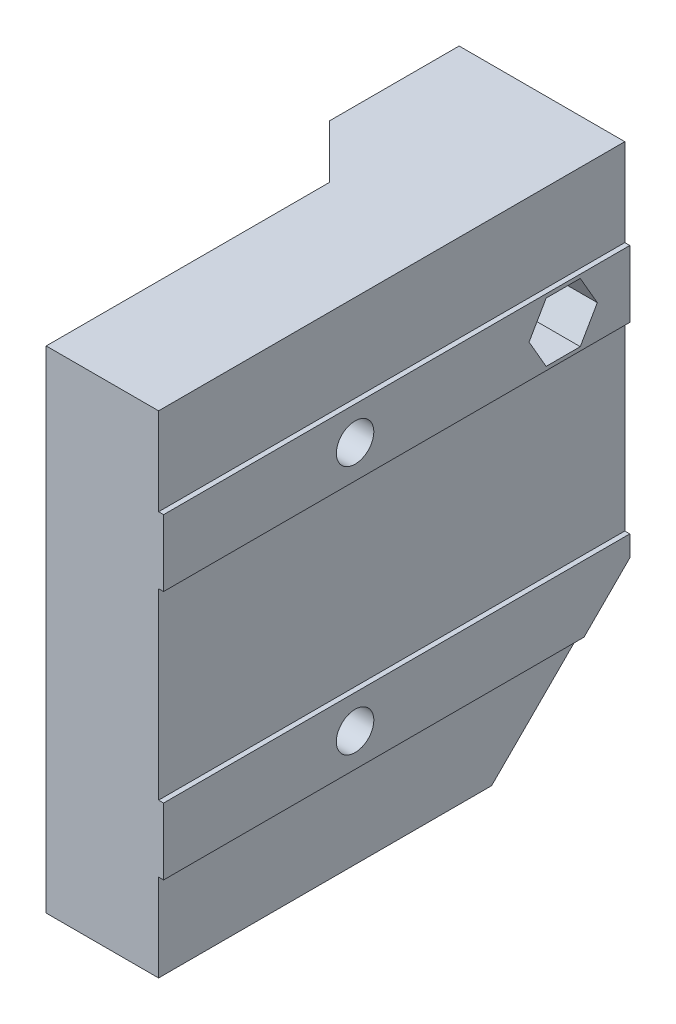
ISO-10303-21;
HEADER;
FILE_DESCRIPTION(('STEP AP214'),'2;1');
FILE_NAME('part.step','',(''),(''),'','','');
FILE_SCHEMA(('AUTOMOTIVE_DESIGN { 1 0 10303 214 1 1 1 1 }'));
ENDSEC;
DATA;
#1=APPLICATION_CONTEXT('core data for automotive mechanical design processes');
#2=APPLICATION_PROTOCOL_DEFINITION('international standard','automotive_design',2000,#1);
#3=PRODUCT_CONTEXT('',#1,'mechanical');
#4=PRODUCT('Part','Part','',(#3));
#5=PRODUCT_RELATED_PRODUCT_CATEGORY('part','',(#4));
#6=PRODUCT_DEFINITION_FORMATION('','',#4);
#7=PRODUCT_DEFINITION_CONTEXT('part definition',#1,'design');
#8=PRODUCT_DEFINITION('design','',#6,#7);
#9=PRODUCT_DEFINITION_SHAPE('','',#8);
#10=(LENGTH_UNIT() NAMED_UNIT(*) SI_UNIT(.MILLI.,.METRE.));
#11=(NAMED_UNIT(*) PLANE_ANGLE_UNIT() SI_UNIT($,.RADIAN.));
#12=(NAMED_UNIT(*) SI_UNIT($,.STERADIAN.) SOLID_ANGLE_UNIT());
#13=UNCERTAINTY_MEASURE_WITH_UNIT(LENGTH_MEASURE(1.E-05),#10,'distance_accuracy_value','');
#14=(GEOMETRIC_REPRESENTATION_CONTEXT(3) GLOBAL_UNCERTAINTY_ASSIGNED_CONTEXT((#13)) GLOBAL_UNIT_ASSIGNED_CONTEXT((#10,
#11,#12)) REPRESENTATION_CONTEXT('',''));
#15=CARTESIAN_POINT('',(0.,0.,0.));
#16=DIRECTION('',(0.,0.,1.));
#17=DIRECTION('',(1.,0.,0.));
#18=AXIS2_PLACEMENT_3D('',#15,#16,#17);
#19=CARTESIAN_POINT('',(-4.9,6.5,-33.));
#20=DIRECTION('',(-1.,0.,0.));
#21=DIRECTION('',(0.,0.,1.));
#22=AXIS2_PLACEMENT_3D('',#19,#20,#21);
#23=PLANE('',#22);
#24=CARTESIAN_POINT('',(-4.9,19.,-25.));
#25=DIRECTION('',(-1.,0.,0.));
#26=DIRECTION('',(0.,0.,1.));
#27=AXIS2_PLACEMENT_3D('',#24,#25,#26);
#28=CIRCLE('',#27,4.69999999999999);
#29=CARTESIAN_POINT('',(-4.9,19.,-20.3));
#30=VERTEX_POINT('',#29);
#31=EDGE_CURVE('E11',#30,#30,#28,.F.);
#32=ORIENTED_EDGE('',*,*,#31,.T.);
#33=EDGE_LOOP('',(#32));
#34=FACE_BOUND('',#33,.T.);
#35=DIRECTION('',(0.,0.,1.));
#36=VECTOR('',#35,1.);
#37=CARTESIAN_POINT('',(-4.9,33.5,-33.));
#38=LINE('',#37,#36);
#39=CARTESIAN_POINT('',(-4.9,33.5,-33.));
#40=VERTEX_POINT('',#39);
#41=CARTESIAN_POINT('',(-4.9,33.5,-17.4000000000001));
#42=VERTEX_POINT('',#41);
#43=EDGE_CURVE('E269',#40,#42,#38,.T.);
#44=ORIENTED_EDGE('',*,*,#43,.F.);
#45=DIRECTION('',(0.,1.,0.));
#46=VECTOR('',#45,1.);
#47=CARTESIAN_POINT('',(-4.9,6.5,-33.));
#48=LINE('',#47,#46);
#49=CARTESIAN_POINT('',(-4.9,6.5,-33.));
#50=VERTEX_POINT('',#49);
#51=EDGE_CURVE('E268',#50,#40,#48,.T.);
#52=ORIENTED_EDGE('',*,*,#51,.F.);
#53=DIRECTION('',(0.,0.,1.));
#54=VECTOR('',#53,1.);
#55=CARTESIAN_POINT('',(-4.9,6.5,-33.));
#56=LINE('',#55,#54);
#57=CARTESIAN_POINT('',(-4.9,6.5,-17.4000000000001));
#58=VERTEX_POINT('',#57);
#59=EDGE_CURVE('E262',#50,#58,#56,.T.);
#60=ORIENTED_EDGE('',*,*,#59,.T.);
#61=DIRECTION('',(0.,1.,0.));
#62=VECTOR('',#61,1.);
#63=CARTESIAN_POINT('',(-4.9,6.5,-17.4000000000001));
#64=LINE('',#63,#62);
#65=EDGE_CURVE('E277',#58,#42,#64,.T.);
#66=ORIENTED_EDGE('',*,*,#65,.T.);
#67=EDGE_LOOP('',(#44,#52,#60,#66));
#68=FACE_BOUND('',#67,.T.);
#69=ADVANCED_FACE('F35',(#34,#68),#23,.T.);
#70=CARTESIAN_POINT('',(15.6,19.,-25.));
#71=DIRECTION('',(-1.,0.,0.));
#72=DIRECTION('',(0.,0.,1.));
#73=AXIS2_PLACEMENT_3D('',#70,#71,#72);
#74=CYLINDRICAL_SURFACE('',#73,2.1);
#75=CARTESIAN_POINT('',(9.6,19.,-25.));
#76=DIRECTION('',(1.,0.,0.));
#77=DIRECTION('',(0.,0.,-1.));
#78=AXIS2_PLACEMENT_3D('',#75,#76,#77);
#79=CIRCLE('',#78,2.1);
#80=CARTESIAN_POINT('',(9.6,19.,-27.1));
#81=VERTEX_POINT('',#80);
#82=EDGE_CURVE('E247',#81,#81,#79,.F.);
#83=ORIENTED_EDGE('',*,*,#82,.F.);
#84=EDGE_LOOP('',(#83));
#85=FACE_BOUND('',#84,.T.);
#86=CARTESIAN_POINT('',(-5.6,19.,-25.));
#87=DIRECTION('',(-1.,0.,0.));
#88=DIRECTION('',(0.,0.,1.));
#89=AXIS2_PLACEMENT_3D('',#86,#87,#88);
#90=CIRCLE('',#89,2.1);
#91=CARTESIAN_POINT('',(-5.6,19.,-22.9));
#92=VERTEX_POINT('',#91);
#93=EDGE_CURVE('E225',#92,#92,#90,.T.);
#94=ORIENTED_EDGE('',*,*,#93,.T.);
#95=EDGE_LOOP('',(#94));
#96=FACE_BOUND('',#95,.T.);
#97=ADVANCED_FACE('F408',(#85,#96),#74,.F.);
#98=CARTESIAN_POINT('',(15.,-15.,10.));
#99=DIRECTION('',(-1.,0.,0.));
#100=DIRECTION('',(0.,-1.,0.));
#101=AXIS2_PLACEMENT_3D('',#98,#99,#100);
#102=PLANE('',#101);
#103=DIRECTION('',(0.,0.,-1.));
#104=VECTOR('',#103,1.);
#105=CARTESIAN_POINT('',(15.,-25.5,10.));
#106=LINE('',#105,#104);
#107=CARTESIAN_POINT('',(15.,-25.5,23.));
#108=VERTEX_POINT('',#107);
#109=CARTESIAN_POINT('',(15.,-25.5,-16.9999999999999));
#110=VERTEX_POINT('',#109);
#111=EDGE_CURVE('E366',#108,#110,#106,.T.);
#112=ORIENTED_EDGE('',*,*,#111,.T.);
#113=DIRECTION('',(0.,0.707106781186547,-0.707106781186549));
#114=VECTOR('',#113,1.);
#115=CARTESIAN_POINT('',(15.,-9.49999999999999,-33.));
#116=LINE('',#115,#114);
#117=CARTESIAN_POINT('',(15.,-15.,-27.5));
#118=VERTEX_POINT('',#117);
#119=EDGE_CURVE('E388',#110,#118,#116,.T.);
#120=ORIENTED_EDGE('',*,*,#119,.T.);
#121=DIRECTION('',(0.,0.,-1.));
#122=VECTOR('',#121,1.);
#123=CARTESIAN_POINT('',(15.,-15.,10.));
#124=LINE('',#123,#122);
#125=CARTESIAN_POINT('',(15.,-15.,23.));
#126=VERTEX_POINT('',#125);
#127=EDGE_CURVE('E384',#126,#118,#124,.T.);
#128=ORIENTED_EDGE('',*,*,#127,.F.);
#129=DIRECTION('',(0.,1.,0.));
#130=VECTOR('',#129,1.);
#131=CARTESIAN_POINT('',(15.,-25.5,23.));
#132=LINE('',#131,#130);
#133=EDGE_CURVE('E316',#108,#126,#132,.T.);
#134=ORIENTED_EDGE('',*,*,#133,.F.);
#135=EDGE_LOOP('',(#112,#120,#128,#134));
#136=FACE_BOUND('',#135,.T.);
#137=ADVANCED_FACE('F414',(#136),#102,.F.);
#138=CARTESIAN_POINT('',(15.,-15.,10.));
#139=DIRECTION('',(0.,1.,0.));
#140=DIRECTION('',(0.,0.,1.));
#141=AXIS2_PLACEMENT_3D('',#138,#139,#140);
#142=PLANE('',#141);
#143=ORIENTED_EDGE('',*,*,#127,.T.);
#144=DIRECTION('',(1.,0.,0.));
#145=VECTOR('',#144,1.);
#146=CARTESIAN_POINT('',(0.,-15.,-27.5));
#147=LINE('',#146,#145);
#148=CARTESIAN_POINT('',(15.6,-15.,-27.5));
#149=VERTEX_POINT('',#148);
#150=EDGE_CURVE('E58',#118,#149,#147,.T.);
#151=ORIENTED_EDGE('',*,*,#150,.T.);
#152=DIRECTION('',(0.,0.,-1.));
#153=VECTOR('',#152,1.);
#154=CARTESIAN_POINT('',(15.6,-15.,10.));
#155=LINE('',#154,#153);
#156=CARTESIAN_POINT('',(15.6,-15.,23.));
#157=VERTEX_POINT('',#156);
#158=EDGE_CURVE('E507',#157,#149,#155,.T.);
#159=ORIENTED_EDGE('',*,*,#158,.F.);
#160=DIRECTION('',(1.,0.,0.));
#161=VECTOR('',#160,1.);
#162=CARTESIAN_POINT('',(15.,-15.,23.));
#163=LINE('',#162,#161);
#164=EDGE_CURVE('E319',#126,#157,#163,.T.);
#165=ORIENTED_EDGE('',*,*,#164,.F.);
#166=EDGE_LOOP('',(#143,#151,#159,#165));
#167=FACE_BOUND('',#166,.T.);
#168=ADVANCED_FACE('F485',(#167),#142,.F.);
#169=CARTESIAN_POINT('',(15.6,-7.,10.));
#170=DIRECTION('',(-1.,0.,0.));
#171=DIRECTION('',(0.,0.,1.));
#172=AXIS2_PLACEMENT_3D('',#169,#170,#171);
#173=PLANE('',#172);
#174=CARTESIAN_POINT('',(15.6,-11.,0.));
#175=DIRECTION('',(-1.,0.,0.));
#176=DIRECTION('',(0.,0.,1.));
#177=AXIS2_PLACEMENT_3D('',#174,#175,#176);
#178=CIRCLE('',#177,2.24999999999999);
#179=CARTESIAN_POINT('',(15.6,-11.,2.24999999999999));
#180=VERTEX_POINT('',#179);
#181=EDGE_CURVE('E349',#180,#180,#178,.T.);
#182=ORIENTED_EDGE('',*,*,#181,.T.);
#183=EDGE_LOOP('',(#182));
#184=FACE_BOUND('',#183,.T.);
#185=ORIENTED_EDGE('',*,*,#158,.T.);
#186=DIRECTION('',(0.,0.707106781186547,-0.707106781186549));
#187=VECTOR('',#186,1.);
#188=CARTESIAN_POINT('',(15.6,-9.5,-33.));
#189=LINE('',#188,#187);
#190=CARTESIAN_POINT('',(15.6,-9.49999999999999,-33.));
#191=VERTEX_POINT('',#190);
#192=EDGE_CURVE('E391',#149,#191,#189,.T.);
#193=ORIENTED_EDGE('',*,*,#192,.T.);
#194=DIRECTION('',(0.,-1.,0.));
#195=VECTOR('',#194,1.);
#196=CARTESIAN_POINT('',(15.6,-7.,-33.));
#197=LINE('',#196,#195);
#198=CARTESIAN_POINT('',(15.6,-7.,-33.));
#199=VERTEX_POINT('',#198);
#200=EDGE_CURVE('E309',#199,#191,#197,.T.);
#201=ORIENTED_EDGE('',*,*,#200,.F.);
#202=DIRECTION('',(0.,0.,-1.));
#203=VECTOR('',#202,1.);
#204=CARTESIAN_POINT('',(15.6,-7.,10.));
#205=LINE('',#204,#203);
#206=CARTESIAN_POINT('',(15.6,-7.,23.));
#207=VERTEX_POINT('',#206);
#208=EDGE_CURVE('E509',#207,#199,#205,.T.);
#209=ORIENTED_EDGE('',*,*,#208,.F.);
#210=DIRECTION('',(0.,1.,0.));
#211=VECTOR('',#210,1.);
#212=CARTESIAN_POINT('',(15.6,-15.,23.));
#213=LINE('',#212,#211);
#214=EDGE_CURVE('E322',#157,#207,#213,.T.);
#215=ORIENTED_EDGE('',*,*,#214,.F.);
#216=EDGE_LOOP('',(#185,#193,#201,#209,#215));
#217=FACE_BOUND('',#216,.T.);
#218=ADVANCED_FACE('F481',(#184,#217),#173,.F.);
#219=CARTESIAN_POINT('',(15.,-7.,10.));
#220=DIRECTION('',(0.,-1.,0.));
#221=DIRECTION('',(0.,0.,-1.));
#222=AXIS2_PLACEMENT_3D('',#219,#220,#221);
#223=PLANE('',#222);
#224=ORIENTED_EDGE('',*,*,#208,.T.);
#225=DIRECTION('',(1.,0.,0.));
#226=VECTOR('',#225,1.);
#227=CARTESIAN_POINT('',(15.6,-7.,-33.));
#228=LINE('',#227,#226);
#229=CARTESIAN_POINT('',(15.,-7.,-33.));
#230=VERTEX_POINT('',#229);
#231=EDGE_CURVE('E306',#230,#199,#228,.T.);
#232=ORIENTED_EDGE('',*,*,#231,.F.);
#233=DIRECTION('',(0.,0.,-1.));
#234=VECTOR('',#233,1.);
#235=CARTESIAN_POINT('',(15.,-7.,10.));
#236=LINE('',#235,#234);
#237=CARTESIAN_POINT('',(15.,-7.,23.));
#238=VERTEX_POINT('',#237);
#239=EDGE_CURVE('E534',#238,#230,#236,.T.);
#240=ORIENTED_EDGE('',*,*,#239,.F.);
#241=DIRECTION('',(-1.,0.,0.));
#242=VECTOR('',#241,1.);
#243=CARTESIAN_POINT('',(15.6,-7.,23.));
#244=LINE('',#243,#242);
#245=EDGE_CURVE('E325',#207,#238,#244,.T.);
#246=ORIENTED_EDGE('',*,*,#245,.F.);
#247=EDGE_LOOP('',(#224,#232,#240,#246));
#248=FACE_BOUND('',#247,.T.);
#249=ADVANCED_FACE('F477',(#248),#223,.F.);
#250=CARTESIAN_POINT('',(15.,15.,10.));
#251=DIRECTION('',(-1.,0.,0.));
#252=DIRECTION('',(0.,0.,1.));
#253=AXIS2_PLACEMENT_3D('',#250,#251,#252);
#254=PLANE('',#253);
#255=ORIENTED_EDGE('',*,*,#239,.T.);
#256=DIRECTION('',(0.,-1.,0.));
#257=VECTOR('',#256,1.);
#258=CARTESIAN_POINT('',(15.,15.,-33.));
#259=LINE('',#258,#257);
#260=CARTESIAN_POINT('',(15.,15.,-33.));
#261=VERTEX_POINT('',#260);
#262=EDGE_CURVE('E303',#261,#230,#259,.T.);
#263=ORIENTED_EDGE('',*,*,#262,.F.);
#264=DIRECTION('',(0.,0.,-1.));
#265=VECTOR('',#264,1.);
#266=CARTESIAN_POINT('',(15.,15.,10.));
#267=LINE('',#266,#265);
#268=CARTESIAN_POINT('',(15.,15.,23.));
#269=VERTEX_POINT('',#268);
#270=EDGE_CURVE('E532',#269,#261,#267,.T.);
#271=ORIENTED_EDGE('',*,*,#270,.F.);
#272=DIRECTION('',(0.,1.,0.));
#273=VECTOR('',#272,1.);
#274=CARTESIAN_POINT('',(15.,-7.,23.));
#275=LINE('',#274,#273);
#276=EDGE_CURVE('E328',#238,#269,#275,.T.);
#277=ORIENTED_EDGE('',*,*,#276,.F.);
#278=EDGE_LOOP('',(#255,#263,#271,#277));
#279=FACE_BOUND('',#278,.T.);
#280=ADVANCED_FACE('F473',(#279),#254,.F.);
#281=CARTESIAN_POINT('',(15.,15.,10.));
#282=DIRECTION('',(0.,1.,0.));
#283=DIRECTION('',(0.,0.,1.));
#284=AXIS2_PLACEMENT_3D('',#281,#282,#283);
#285=PLANE('',#284);
#286=ORIENTED_EDGE('',*,*,#270,.T.);
#287=DIRECTION('',(-1.,0.,0.));
#288=VECTOR('',#287,1.);
#289=CARTESIAN_POINT('',(15.6,15.,-33.));
#290=LINE('',#289,#288);
#291=CARTESIAN_POINT('',(15.6,15.,-33.));
#292=VERTEX_POINT('',#291);
#293=EDGE_CURVE('E300',#292,#261,#290,.T.);
#294=ORIENTED_EDGE('',*,*,#293,.F.);
#295=DIRECTION('',(0.,0.,-1.));
#296=VECTOR('',#295,1.);
#297=CARTESIAN_POINT('',(15.6,15.,10.));
#298=LINE('',#297,#296);
#299=CARTESIAN_POINT('',(15.6,15.,23.));
#300=VERTEX_POINT('',#299);
#301=EDGE_CURVE('E530',#300,#292,#298,.T.);
#302=ORIENTED_EDGE('',*,*,#301,.F.);
#303=DIRECTION('',(1.,0.,0.));
#304=VECTOR('',#303,1.);
#305=CARTESIAN_POINT('',(15.,15.,23.));
#306=LINE('',#305,#304);
#307=EDGE_CURVE('E331',#269,#300,#306,.T.);
#308=ORIENTED_EDGE('',*,*,#307,.F.);
#309=EDGE_LOOP('',(#286,#294,#302,#308));
#310=FACE_BOUND('',#309,.T.);
#311=ADVANCED_FACE('F469',(#310),#285,.F.);
#312=CARTESIAN_POINT('',(15.6,23.,10.));
#313=DIRECTION('',(-1.,0.,0.));
#314=DIRECTION('',(0.,0.,1.));
#315=AXIS2_PLACEMENT_3D('',#312,#313,#314);
#316=PLANE('',#315);
#317=DIRECTION('',(0.,0.866025403784439,0.5));
#318=VECTOR('',#317,1.);
#319=CARTESIAN_POINT('',(15.6,19.,-29.0991869112463));
#320=LINE('',#319,#318);
#321=CARTESIAN_POINT('',(15.6,19.,-29.0991869112463));
#322=VERTEX_POINT('',#321);
#323=CARTESIAN_POINT('',(15.6,22.55,-27.0495934556232));
#324=VERTEX_POINT('',#323);
#325=EDGE_CURVE('E235',#322,#324,#320,.T.);
#326=ORIENTED_EDGE('',*,*,#325,.F.);
#327=DIRECTION('',(0.,0.866025403784438,-0.5));
#328=VECTOR('',#327,1.);
#329=CARTESIAN_POINT('',(15.6,15.45,-27.0495934556232));
#330=LINE('',#329,#328);
#331=CARTESIAN_POINT('',(15.6,15.45,-27.0495934556232));
#332=VERTEX_POINT('',#331);
#333=EDGE_CURVE('E50',#332,#322,#330,.T.);
#334=ORIENTED_EDGE('',*,*,#333,.F.);
#335=DIRECTION('',(0.,0.,-1.));
#336=VECTOR('',#335,1.);
#337=CARTESIAN_POINT('',(15.6,15.45,-22.9504065443768));
#338=LINE('',#337,#336);
#339=CARTESIAN_POINT('',(15.6,15.45,-22.9504065443768));
#340=VERTEX_POINT('',#339);
#341=EDGE_CURVE('E219',#340,#332,#338,.T.);
#342=ORIENTED_EDGE('',*,*,#341,.F.);
#343=DIRECTION('',(0.,-0.866025403784439,-0.5));
#344=VECTOR('',#343,1.);
#345=CARTESIAN_POINT('',(15.6,19.,-20.9008130887537));
#346=LINE('',#345,#344);
#347=CARTESIAN_POINT('',(15.6,19.,-20.9008130887537));
#348=VERTEX_POINT('',#347);
#349=EDGE_CURVE('E222',#348,#340,#346,.T.);
#350=ORIENTED_EDGE('',*,*,#349,.F.);
#351=DIRECTION('',(0.,-0.866025403784438,0.5));
#352=VECTOR('',#351,1.);
#353=CARTESIAN_POINT('',(15.6,22.55,-22.9504065443768));
#354=LINE('',#353,#352);
#355=CARTESIAN_POINT('',(15.6,22.55,-22.9504065443768));
#356=VERTEX_POINT('',#355);
#357=EDGE_CURVE('E240',#356,#348,#354,.T.);
#358=ORIENTED_EDGE('',*,*,#357,.F.);
#359=DIRECTION('',(0.,0.,1.));
#360=VECTOR('',#359,1.);
#361=CARTESIAN_POINT('',(15.6,22.55,-27.0495934556232));
#362=LINE('',#361,#360);
#363=EDGE_CURVE('E237',#324,#356,#362,.T.);
#364=ORIENTED_EDGE('',*,*,#363,.F.);
#365=EDGE_LOOP('',(#326,#334,#342,#350,#358,#364));
#366=FACE_BOUND('',#365,.T.);
#367=CARTESIAN_POINT('',(15.6,19.,0.));
#368=DIRECTION('',(-1.,0.,0.));
#369=DIRECTION('',(0.,0.,1.));
#370=AXIS2_PLACEMENT_3D('',#367,#368,#369);
#371=CIRCLE('',#370,2.24999999999999);
#372=CARTESIAN_POINT('',(15.6,19.,2.24999999999999));
#373=VERTEX_POINT('',#372);
#374=EDGE_CURVE('E357',#373,#373,#371,.T.);
#375=ORIENTED_EDGE('',*,*,#374,.T.);
#376=EDGE_LOOP('',(#375));
#377=FACE_BOUND('',#376,.T.);
#378=ORIENTED_EDGE('',*,*,#301,.T.);
#379=DIRECTION('',(0.,-1.,0.));
#380=VECTOR('',#379,1.);
#381=CARTESIAN_POINT('',(15.6,23.,-33.));
#382=LINE('',#381,#380);
#383=CARTESIAN_POINT('',(15.6,23.,-33.));
#384=VERTEX_POINT('',#383);
#385=EDGE_CURVE('E297',#384,#292,#382,.T.);
#386=ORIENTED_EDGE('',*,*,#385,.F.);
#387=DIRECTION('',(0.,0.,-1.));
#388=VECTOR('',#387,1.);
#389=CARTESIAN_POINT('',(15.6,23.,10.));
#390=LINE('',#389,#388);
#391=CARTESIAN_POINT('',(15.6,23.,23.));
#392=VERTEX_POINT('',#391);
#393=EDGE_CURVE('E528',#392,#384,#390,.T.);
#394=ORIENTED_EDGE('',*,*,#393,.F.);
#395=DIRECTION('',(0.,1.,0.));
#396=VECTOR('',#395,1.);
#397=CARTESIAN_POINT('',(15.6,15.,23.));
#398=LINE('',#397,#396);
#399=EDGE_CURVE('E334',#300,#392,#398,.T.);
#400=ORIENTED_EDGE('',*,*,#399,.F.);
#401=EDGE_LOOP('',(#378,#386,#394,#400));
#402=FACE_BOUND('',#401,.T.);
#403=ADVANCED_FACE('F465',(#366,#377,#402),#316,.F.);
#404=CARTESIAN_POINT('',(15.,23.,10.));
#405=DIRECTION('',(0.,-1.,0.));
#406=DIRECTION('',(0.,0.,-1.));
#407=AXIS2_PLACEMENT_3D('',#404,#405,#406);
#408=PLANE('',#407);
#409=ORIENTED_EDGE('',*,*,#393,.T.);
#410=DIRECTION('',(1.,0.,0.));
#411=VECTOR('',#410,1.);
#412=CARTESIAN_POINT('',(15.,23.,-33.));
#413=LINE('',#412,#411);
#414=CARTESIAN_POINT('',(15.,23.,-33.));
#415=VERTEX_POINT('',#414);
#416=EDGE_CURVE('E294',#415,#384,#413,.T.);
#417=ORIENTED_EDGE('',*,*,#416,.F.);
#418=DIRECTION('',(0.,0.,-1.));
#419=VECTOR('',#418,1.);
#420=CARTESIAN_POINT('',(15.,23.,10.));
#421=LINE('',#420,#419);
#422=CARTESIAN_POINT('',(15.,23.,23.));
#423=VERTEX_POINT('',#422);
#424=EDGE_CURVE('E526',#423,#415,#421,.T.);
#425=ORIENTED_EDGE('',*,*,#424,.F.);
#426=DIRECTION('',(-1.,0.,0.));
#427=VECTOR('',#426,1.);
#428=CARTESIAN_POINT('',(15.6,23.,23.));
#429=LINE('',#428,#427);
#430=EDGE_CURVE('E337',#392,#423,#429,.T.);
#431=ORIENTED_EDGE('',*,*,#430,.F.);
#432=EDGE_LOOP('',(#409,#417,#425,#431));
#433=FACE_BOUND('',#432,.T.);
#434=ADVANCED_FACE('F461',(#433),#408,.F.);
#435=CARTESIAN_POINT('',(15.,33.5,10.));
#436=DIRECTION('',(-1.,0.,0.));
#437=DIRECTION('',(0.,-1.,0.));
#438=AXIS2_PLACEMENT_3D('',#435,#436,#437);
#439=PLANE('',#438);
#440=ORIENTED_EDGE('',*,*,#424,.T.);
#441=DIRECTION('',(0.,-1.,0.));
#442=VECTOR('',#441,1.);
#443=CARTESIAN_POINT('',(15.,33.5,-33.));
#444=LINE('',#443,#442);
#445=CARTESIAN_POINT('',(15.,33.5,-33.));
#446=VERTEX_POINT('',#445);
#447=EDGE_CURVE('E291',#446,#415,#444,.T.);
#448=ORIENTED_EDGE('',*,*,#447,.F.);
#449=DIRECTION('',(0.,0.,-1.));
#450=VECTOR('',#449,1.);
#451=CARTESIAN_POINT('',(15.,33.5,10.));
#452=LINE('',#451,#450);
#453=CARTESIAN_POINT('',(15.,33.5,23.));
#454=VERTEX_POINT('',#453);
#455=EDGE_CURVE('E524',#454,#446,#452,.T.);
#456=ORIENTED_EDGE('',*,*,#455,.F.);
#457=DIRECTION('',(0.,1.,0.));
#458=VECTOR('',#457,1.);
#459=CARTESIAN_POINT('',(15.,23.,23.));
#460=LINE('',#459,#458);
#461=EDGE_CURVE('E340',#423,#454,#460,.T.);
#462=ORIENTED_EDGE('',*,*,#461,.F.);
#463=EDGE_LOOP('',(#440,#448,#456,#462));
#464=FACE_BOUND('',#463,.T.);
#465=ADVANCED_FACE('F457',(#464),#439,.F.);
#466=CARTESIAN_POINT('',(1.5,33.5,10.));
#467=DIRECTION('',(0.,-1.,0.));
#468=DIRECTION('',(0.,0.,-1.));
#469=AXIS2_PLACEMENT_3D('',#466,#467,#468);
#470=PLANE('',#469);
#471=ORIENTED_EDGE('',*,*,#455,.T.);
#472=DIRECTION('',(1.,0.,0.));
#473=VECTOR('',#472,1.);
#474=CARTESIAN_POINT('',(1.5,33.5,-33.));
#475=LINE('',#474,#473);
#476=EDGE_CURVE('E288',#40,#446,#475,.T.);
#477=ORIENTED_EDGE('',*,*,#476,.F.);
#478=ORIENTED_EDGE('',*,*,#43,.T.);
#479=DIRECTION('',(0.707106781186544,0.,0.707106781186551));
#480=VECTOR('',#479,1.);
#481=CARTESIAN_POINT('',(-4.9,33.5,-17.4000000000001));
#482=LINE('',#481,#480);
#483=CARTESIAN_POINT('',(1.5,33.5,-11.));
#484=VERTEX_POINT('',#483);
#485=EDGE_CURVE('E259',#42,#484,#482,.T.);
#486=ORIENTED_EDGE('',*,*,#485,.T.);
#487=DIRECTION('',(0.,0.,-1.));
#488=VECTOR('',#487,1.);
#489=CARTESIAN_POINT('',(1.5,33.5,10.));
#490=LINE('',#489,#488);
#491=CARTESIAN_POINT('',(1.5,33.5,23.));
#492=VERTEX_POINT('',#491);
#493=EDGE_CURVE('E376',#492,#484,#490,.T.);
#494=ORIENTED_EDGE('',*,*,#493,.F.);
#495=DIRECTION('',(-1.,0.,0.));
#496=VECTOR('',#495,1.);
#497=CARTESIAN_POINT('',(15.,33.5,23.));
#498=LINE('',#497,#496);
#499=EDGE_CURVE('E343',#454,#492,#498,.T.);
#500=ORIENTED_EDGE('',*,*,#499,.F.);
#501=EDGE_LOOP('',(#471,#477,#478,#486,#494,#500));
#502=FACE_BOUND('',#501,.T.);
#503=ADVANCED_FACE('F453',(#502),#470,.F.);
#504=CARTESIAN_POINT('',(0.,0.,10.));
#505=DIRECTION('',(0.,0.,-1.));
#506=DIRECTION('',(-1.,0.,0.));
#507=AXIS2_PLACEMENT_3D('',#504,#505,#506);
#508=CYLINDRICAL_SURFACE('',#507,6.);
#509=DIRECTION('',(0.,0.,-1.));
#510=VECTOR('',#509,1.);
#511=CARTESIAN_POINT('',(1.50000000000001,5.80947501931112,10.));
#512=LINE('',#511,#510);
#513=CARTESIAN_POINT('',(1.50000000000001,5.80947501931112,10.));
#514=VERTEX_POINT('',#513);
#515=CARTESIAN_POINT('',(1.50000000000001,5.80947501931112,-33.));
#516=VERTEX_POINT('',#515);
#517=EDGE_CURVE('E374',#514,#516,#512,.T.);
#518=ORIENTED_EDGE('',*,*,#517,.T.);
#519=CARTESIAN_POINT('',(0.,0.,-33.));
#520=DIRECTION('',(0.,0.,1.));
#521=DIRECTION('',(-1.,0.,0.));
#522=AXIS2_PLACEMENT_3D('',#519,#520,#521);
#523=CIRCLE('',#522,6.);
#524=CARTESIAN_POINT('',(1.5,-5.80947501931112,-33.));
#525=VERTEX_POINT('',#524);
#526=EDGE_CURVE('E282',#525,#516,#523,.T.);
#527=ORIENTED_EDGE('',*,*,#526,.F.);
#528=DIRECTION('',(0.,0.,-1.));
#529=VECTOR('',#528,1.);
#530=CARTESIAN_POINT('',(1.5,-5.80947501931112,10.));
#531=LINE('',#530,#529);
#532=CARTESIAN_POINT('',(1.50000000000001,-5.80947501931112,10.));
#533=VERTEX_POINT('',#532);
#534=EDGE_CURVE('E377',#533,#525,#531,.T.);
#535=ORIENTED_EDGE('',*,*,#534,.F.);
#536=CARTESIAN_POINT('',(0.,0.,10.));
#537=DIRECTION('',(0.,0.,-1.));
#538=DIRECTION('',(1.,0.,0.));
#539=AXIS2_PLACEMENT_3D('',#536,#537,#538);
#540=CIRCLE('',#539,6.);
#541=EDGE_CURVE('E363',#514,#533,#540,.T.);
#542=ORIENTED_EDGE('',*,*,#541,.F.);
#543=EDGE_LOOP('',(#518,#527,#535,#542));
#544=FACE_BOUND('',#543,.T.);
#545=ADVANCED_FACE('F449',(#544),#508,.F.);
#546=CARTESIAN_POINT('',(1.5,-5.80947501931112,10.));
#547=DIRECTION('',(1.,0.,0.));
#548=DIRECTION('',(0.,1.,0.));
#549=AXIS2_PLACEMENT_3D('',#546,#547,#548);
#550=PLANE('',#549);
#551=CARTESIAN_POINT('',(1.5,-11.,0.));
#552=DIRECTION('',(1.,0.,0.));
#553=DIRECTION('',(0.,1.,0.));
#554=AXIS2_PLACEMENT_3D('',#551,#552,#553);
#555=CIRCLE('',#554,2.25);
#556=CARTESIAN_POINT('',(1.5,-8.75,0.));
#557=VERTEX_POINT('',#556);
#558=EDGE_CURVE('E356',#557,#557,#555,.T.);
#559=ORIENTED_EDGE('',*,*,#558,.T.);
#560=EDGE_LOOP('',(#559));
#561=FACE_BOUND('',#560,.T.);
#562=DIRECTION('',(0.,1.,0.));
#563=VECTOR('',#562,1.);
#564=CARTESIAN_POINT('',(1.50000000000001,-25.5,-33.));
#565=LINE('',#564,#563);
#566=CARTESIAN_POINT('',(1.50000000000001,-9.5,-33.));
#567=VERTEX_POINT('',#566);
#568=EDGE_CURVE('E276',#567,#525,#565,.T.);
#569=ORIENTED_EDGE('',*,*,#568,.F.);
#570=DIRECTION('',(0.,-0.707106781186547,0.707106781186549));
#571=VECTOR('',#570,1.);
#572=CARTESIAN_POINT('',(1.50000000000001,-9.49999999999999,-33.));
#573=LINE('',#572,#571);
#574=CARTESIAN_POINT('',(1.50000000000001,-25.5,-17.));
#575=VERTEX_POINT('',#574);
#576=EDGE_CURVE('E383',#567,#575,#573,.T.);
#577=ORIENTED_EDGE('',*,*,#576,.T.);
#578=DIRECTION('',(0.,0.,-1.));
#579=VECTOR('',#578,1.);
#580=CARTESIAN_POINT('',(1.50000000000001,-25.5,10.));
#581=LINE('',#580,#579);
#582=CARTESIAN_POINT('',(1.50000000000001,-25.5,23.));
#583=VERTEX_POINT('',#582);
#584=EDGE_CURVE('E515',#583,#575,#581,.T.);
#585=ORIENTED_EDGE('',*,*,#584,.F.);
#586=DIRECTION('',(0.,-1.,0.));
#587=VECTOR('',#586,1.);
#588=CARTESIAN_POINT('',(1.5,33.5,23.));
#589=LINE('',#588,#587);
#590=EDGE_CURVE('E346',#492,#583,#589,.T.);
#591=ORIENTED_EDGE('',*,*,#590,.F.);
#592=ORIENTED_EDGE('',*,*,#493,.T.);
#593=DIRECTION('',(0.,1.,0.));
#594=VECTOR('',#593,1.);
#595=CARTESIAN_POINT('',(1.5,6.5,-11.));
#596=LINE('',#595,#594);
#597=CARTESIAN_POINT('',(1.5,6.5,-11.));
#598=VERTEX_POINT('',#597);
#599=EDGE_CURVE('E274',#598,#484,#596,.T.);
#600=ORIENTED_EDGE('',*,*,#599,.F.);
#601=DIRECTION('',(0.,0.,-1.));
#602=VECTOR('',#601,1.);
#603=CARTESIAN_POINT('',(1.5,6.5,-11.));
#604=LINE('',#603,#602);
#605=CARTESIAN_POINT('',(1.5,6.5,-33.));
#606=VERTEX_POINT('',#605);
#607=EDGE_CURVE('E255',#598,#606,#604,.T.);
#608=ORIENTED_EDGE('',*,*,#607,.T.);
#609=DIRECTION('',(0.,1.,0.));
#610=VECTOR('',#609,1.);
#611=CARTESIAN_POINT('',(1.50000000000001,5.80947501931112,-33.));
#612=LINE('',#611,#610);
#613=EDGE_CURVE('E285',#516,#606,#612,.T.);
#614=ORIENTED_EDGE('',*,*,#613,.F.);
#615=ORIENTED_EDGE('',*,*,#517,.F.);
#616=DIRECTION('',(0.,-1.,0.));
#617=VECTOR('',#616,1.);
#618=CARTESIAN_POINT('',(1.50000000000001,-5.80947501931112,10.));
#619=LINE('',#618,#617);
#620=EDGE_CURVE('E312',#514,#533,#619,.T.);
#621=ORIENTED_EDGE('',*,*,#620,.T.);
#622=ORIENTED_EDGE('',*,*,#534,.T.);
#623=EDGE_LOOP('',(#569,#577,#585,#591,#592,#600,#608,#614,#615,#621,#622));
#624=FACE_BOUND('',#623,.T.);
#625=CARTESIAN_POINT('',(1.5,19.,0.));
#626=DIRECTION('',(1.,0.,0.));
#627=DIRECTION('',(0.,1.,0.));
#628=AXIS2_PLACEMENT_3D('',#625,#626,#627);
#629=CIRCLE('',#628,2.25);
#630=CARTESIAN_POINT('',(1.5,21.25,0.));
#631=VERTEX_POINT('',#630);
#632=EDGE_CURVE('E360',#631,#631,#629,.T.);
#633=ORIENTED_EDGE('',*,*,#632,.T.);
#634=EDGE_LOOP('',(#633));
#635=FACE_BOUND('',#634,.T.);
#636=ADVANCED_FACE('F445',(#561,#624,#635),#550,.F.);
#637=CARTESIAN_POINT('',(1.50000000000001,-25.5,10.));
#638=DIRECTION('',(0.,1.,0.));
#639=DIRECTION('',(-1.,0.,0.));
#640=AXIS2_PLACEMENT_3D('',#637,#638,#639);
#641=PLANE('',#640);
#642=ORIENTED_EDGE('',*,*,#584,.T.);
#643=DIRECTION('',(1.,0.,0.));
#644=VECTOR('',#643,1.);
#645=CARTESIAN_POINT('',(15.,-25.5,-17.));
#646=LINE('',#645,#644);
#647=EDGE_CURVE('E386',#575,#110,#646,.T.);
#648=ORIENTED_EDGE('',*,*,#647,.T.);
#649=ORIENTED_EDGE('',*,*,#111,.F.);
#650=DIRECTION('',(1.,0.,0.));
#651=VECTOR('',#650,1.);
#652=CARTESIAN_POINT('',(1.50000000000001,-25.5,23.));
#653=LINE('',#652,#651);
#654=EDGE_CURVE('E313',#583,#108,#653,.T.);
#655=ORIENTED_EDGE('',*,*,#654,.F.);
#656=EDGE_LOOP('',(#642,#648,#649,#655));
#657=FACE_BOUND('',#656,.T.);
#658=ADVANCED_FACE('F441',(#657),#641,.F.);
#659=CARTESIAN_POINT('',(-14.,19.,0.));
#660=DIRECTION('',(-1.,0.,0.));
#661=DIRECTION('',(0.,0.,1.));
#662=AXIS2_PLACEMENT_3D('',#659,#660,#661);
#663=CYLINDRICAL_SURFACE('',#662,2.25);
#664=ORIENTED_EDGE('',*,*,#374,.F.);
#665=EDGE_LOOP('',(#664));
#666=FACE_BOUND('',#665,.T.);
#667=ORIENTED_EDGE('',*,*,#632,.F.);
#668=EDGE_LOOP('',(#667));
#669=FACE_BOUND('',#668,.T.);
#670=ADVANCED_FACE('F437',(#666,#669),#663,.F.);
#671=CARTESIAN_POINT('',(-14.,-11.,0.));
#672=DIRECTION('',(-1.,0.,0.));
#673=DIRECTION('',(0.,0.,1.));
#674=AXIS2_PLACEMENT_3D('',#671,#672,#673);
#675=CYLINDRICAL_SURFACE('',#674,2.25);
#676=ORIENTED_EDGE('',*,*,#181,.F.);
#677=EDGE_LOOP('',(#676));
#678=FACE_BOUND('',#677,.T.);
#679=ORIENTED_EDGE('',*,*,#558,.F.);
#680=EDGE_LOOP('',(#679));
#681=FACE_BOUND('',#680,.T.);
#682=ADVANCED_FACE('F433',(#678,#681),#675,.F.);
#683=CARTESIAN_POINT('',(0.,0.,10.));
#684=DIRECTION('',(0.,0.,1.));
#685=DIRECTION('',(1.,0.,0.));
#686=AXIS2_PLACEMENT_3D('',#683,#684,#685);
#687=PLANE('',#686);
#688=ORIENTED_EDGE('',*,*,#620,.F.);
#689=ORIENTED_EDGE('',*,*,#541,.T.);
#690=EDGE_LOOP('',(#688,#689));
#691=FACE_BOUND('',#690,.T.);
#692=ADVANCED_FACE('F429',(#691),#687,.F.);
#693=CARTESIAN_POINT('',(0.,0.,23.));
#694=DIRECTION('',(0.,0.,1.));
#695=DIRECTION('',(1.,0.,0.));
#696=AXIS2_PLACEMENT_3D('',#693,#694,#695);
#697=PLANE('',#696);
#698=ORIENTED_EDGE('',*,*,#654,.T.);
#699=ORIENTED_EDGE('',*,*,#133,.T.);
#700=ORIENTED_EDGE('',*,*,#164,.T.);
#701=ORIENTED_EDGE('',*,*,#214,.T.);
#702=ORIENTED_EDGE('',*,*,#245,.T.);
#703=ORIENTED_EDGE('',*,*,#276,.T.);
#704=ORIENTED_EDGE('',*,*,#307,.T.);
#705=ORIENTED_EDGE('',*,*,#399,.T.);
#706=ORIENTED_EDGE('',*,*,#430,.T.);
#707=ORIENTED_EDGE('',*,*,#461,.T.);
#708=ORIENTED_EDGE('',*,*,#499,.T.);
#709=ORIENTED_EDGE('',*,*,#590,.T.);
#710=EDGE_LOOP('',(#698,#699,#700,#701,#702,#703,#704,#705,#706,#707,#708,#709));
#711=FACE_BOUND('',#710,.T.);
#712=ADVANCED_FACE('F425',(#711),#697,.T.);
#713=CARTESIAN_POINT('',(0.,0.,-33.));
#714=DIRECTION('',(0.,0.,-1.));
#715=DIRECTION('',(-1.,0.,0.));
#716=AXIS2_PLACEMENT_3D('',#713,#714,#715);
#717=PLANE('',#716);
#718=ORIENTED_EDGE('',*,*,#200,.T.);
#719=DIRECTION('',(-1.,0.,0.));
#720=VECTOR('',#719,1.);
#721=CARTESIAN_POINT('',(1.50000000000001,-9.49999999999999,-33.));
#722=LINE('',#721,#720);
#723=EDGE_CURVE('E380',#191,#567,#722,.T.);
#724=ORIENTED_EDGE('',*,*,#723,.T.);
#725=ORIENTED_EDGE('',*,*,#568,.T.);
#726=ORIENTED_EDGE('',*,*,#526,.T.);
#727=ORIENTED_EDGE('',*,*,#613,.T.);
#728=DIRECTION('',(-1.,0.,0.));
#729=VECTOR('',#728,1.);
#730=CARTESIAN_POINT('',(1.5,6.5,-33.));
#731=LINE('',#730,#729);
#732=EDGE_CURVE('E258',#606,#50,#731,.T.);
#733=ORIENTED_EDGE('',*,*,#732,.T.);
#734=ORIENTED_EDGE('',*,*,#51,.T.);
#735=ORIENTED_EDGE('',*,*,#476,.T.);
#736=ORIENTED_EDGE('',*,*,#447,.T.);
#737=ORIENTED_EDGE('',*,*,#416,.T.);
#738=ORIENTED_EDGE('',*,*,#385,.T.);
#739=ORIENTED_EDGE('',*,*,#293,.T.);
#740=ORIENTED_EDGE('',*,*,#262,.T.);
#741=ORIENTED_EDGE('',*,*,#231,.T.);
#742=EDGE_LOOP('',(#718,#724,#725,#726,#727,#733,#734,#735,#736,#737,#738,#739,#740,#741));
#743=FACE_BOUND('',#742,.T.);
#744=ADVANCED_FACE('F422',(#743),#717,.T.);
#745=CARTESIAN_POINT('',(-4.9,6.5,-17.4000000000001));
#746=DIRECTION('',(-0.707106781186551,0.,0.707106781186544));
#747=DIRECTION('',(0.707106781186544,0.,0.707106781186551));
#748=AXIS2_PLACEMENT_3D('',#745,#746,#747);
#749=PLANE('',#748);
#750=ORIENTED_EDGE('',*,*,#485,.F.);
#751=ORIENTED_EDGE('',*,*,#65,.F.);
#752=DIRECTION('',(0.707106781186544,0.,0.707106781186551));
#753=VECTOR('',#752,1.);
#754=CARTESIAN_POINT('',(-4.9,6.5,-17.4000000000001));
#755=LINE('',#754,#753);
#756=EDGE_CURVE('E265',#58,#598,#755,.T.);
#757=ORIENTED_EDGE('',*,*,#756,.T.);
#758=ORIENTED_EDGE('',*,*,#599,.T.);
#759=EDGE_LOOP('',(#750,#751,#757,#758));
#760=FACE_BOUND('',#759,.T.);
#761=ADVANCED_FACE('F420',(#760),#749,.T.);
#762=CARTESIAN_POINT('',(0.,6.5,0.));
#763=DIRECTION('',(0.,1.,0.));
#764=DIRECTION('',(0.,0.,1.));
#765=AXIS2_PLACEMENT_3D('',#762,#763,#764);
#766=PLANE('',#765);
#767=ORIENTED_EDGE('',*,*,#607,.F.);
#768=ORIENTED_EDGE('',*,*,#756,.F.);
#769=ORIENTED_EDGE('',*,*,#59,.F.);
#770=ORIENTED_EDGE('',*,*,#732,.F.);
#771=EDGE_LOOP('',(#767,#768,#769,#770));
#772=FACE_BOUND('',#771,.T.);
#773=ADVANCED_FACE('F493',(#772),#766,.F.);
#774=CARTESIAN_POINT('',(0.,-9.49999999999999,-33.));
#775=DIRECTION('',(0.,-0.707106781186549,-0.707106781186547));
#776=DIRECTION('',(1.,0.,0.));
#777=AXIS2_PLACEMENT_3D('',#774,#775,#776);
#778=PLANE('',#777);
#779=ORIENTED_EDGE('',*,*,#119,.F.);
#780=ORIENTED_EDGE('',*,*,#647,.F.);
#781=ORIENTED_EDGE('',*,*,#576,.F.);
#782=ORIENTED_EDGE('',*,*,#723,.F.);
#783=ORIENTED_EDGE('',*,*,#192,.F.);
#784=ORIENTED_EDGE('',*,*,#150,.F.);
#785=EDGE_LOOP('',(#779,#780,#781,#782,#783,#784));
#786=FACE_BOUND('',#785,.T.);
#787=ADVANCED_FACE('F491',(#786),#778,.T.);
#788=CARTESIAN_POINT('',(9.6,0.,0.));
#789=DIRECTION('',(1.,0.,0.));
#790=DIRECTION('',(0.,0.,-1.));
#791=AXIS2_PLACEMENT_3D('',#788,#789,#790);
#792=PLANE('',#791);
#793=DIRECTION('',(0.,0.866025403784438,-0.5));
#794=VECTOR('',#793,1.);
#795=CARTESIAN_POINT('',(9.6,15.45,-27.0495934556232));
#796=LINE('',#795,#794);
#797=CARTESIAN_POINT('',(9.6,15.45,-27.0495934556232));
#798=VERTEX_POINT('',#797);
#799=CARTESIAN_POINT('',(9.6,19.,-29.0991869112463));
#800=VERTEX_POINT('',#799);
#801=EDGE_CURVE('E199',#798,#800,#796,.T.);
#802=ORIENTED_EDGE('',*,*,#801,.T.);
#803=DIRECTION('',(0.,0.866025403784439,0.5));
#804=VECTOR('',#803,1.);
#805=CARTESIAN_POINT('',(9.6,19.,-29.0991869112463));
#806=LINE('',#805,#804);
#807=CARTESIAN_POINT('',(9.6,22.55,-27.0495934556232));
#808=VERTEX_POINT('',#807);
#809=EDGE_CURVE('E208',#800,#808,#806,.T.);
#810=ORIENTED_EDGE('',*,*,#809,.T.);
#811=DIRECTION('',(0.,0.,1.));
#812=VECTOR('',#811,1.);
#813=CARTESIAN_POINT('',(9.6,22.55,-27.0495934556232));
#814=LINE('',#813,#812);
#815=CARTESIAN_POINT('',(9.6,22.55,-22.9504065443768));
#816=VERTEX_POINT('',#815);
#817=EDGE_CURVE('E213',#808,#816,#814,.T.);
#818=ORIENTED_EDGE('',*,*,#817,.T.);
#819=DIRECTION('',(0.,-0.866025403784438,0.5));
#820=VECTOR('',#819,1.);
#821=CARTESIAN_POINT('',(9.6,22.55,-22.9504065443768));
#822=LINE('',#821,#820);
#823=CARTESIAN_POINT('',(9.6,19.,-20.9008130887537));
#824=VERTEX_POINT('',#823);
#825=EDGE_CURVE('E228',#816,#824,#822,.T.);
#826=ORIENTED_EDGE('',*,*,#825,.T.);
#827=DIRECTION('',(0.,-0.866025403784439,-0.5));
#828=VECTOR('',#827,1.);
#829=CARTESIAN_POINT('',(9.6,19.,-20.9008130887537));
#830=LINE('',#829,#828);
#831=CARTESIAN_POINT('',(9.6,15.45,-22.9504065443768));
#832=VERTEX_POINT('',#831);
#833=EDGE_CURVE('E231',#824,#832,#830,.T.);
#834=ORIENTED_EDGE('',*,*,#833,.T.);
#835=DIRECTION('',(0.,0.,-1.));
#836=VECTOR('',#835,1.);
#837=CARTESIAN_POINT('',(9.6,15.45,-22.9504065443768));
#838=LINE('',#837,#836);
#839=EDGE_CURVE('E205',#832,#798,#838,.T.);
#840=ORIENTED_EDGE('',*,*,#839,.T.);
#841=EDGE_LOOP('',(#802,#810,#818,#826,#834,#840));
#842=FACE_BOUND('',#841,.T.);
#843=ORIENTED_EDGE('',*,*,#82,.T.);
#844=EDGE_LOOP('',(#843));
#845=FACE_BOUND('',#844,.T.);
#846=ADVANCED_FACE('F215',(#842,#845),#792,.T.);
#847=CARTESIAN_POINT('',(9.6,15.45,-27.0495934556232));
#848=DIRECTION('',(0.,-0.5,-0.866025403784438));
#849=DIRECTION('',(0.,0.866025403784438,-0.5));
#850=AXIS2_PLACEMENT_3D('',#847,#848,#849);
#851=PLANE('',#850);
#852=ORIENTED_EDGE('',*,*,#333,.T.);
#853=DIRECTION('',(1.,0.,0.));
#854=VECTOR('',#853,1.);
#855=CARTESIAN_POINT('',(9.6,19.,-29.0991869112463));
#856=LINE('',#855,#854);
#857=EDGE_CURVE('E195',#800,#322,#856,.T.);
#858=ORIENTED_EDGE('',*,*,#857,.F.);
#859=ORIENTED_EDGE('',*,*,#801,.F.);
#860=DIRECTION('',(1.,0.,0.));
#861=VECTOR('',#860,1.);
#862=CARTESIAN_POINT('',(9.6,15.45,-27.0495934556232));
#863=LINE('',#862,#861);
#864=EDGE_CURVE('E245',#798,#332,#863,.T.);
#865=ORIENTED_EDGE('',*,*,#864,.T.);
#866=EDGE_LOOP('',(#852,#858,#859,#865));
#867=FACE_BOUND('',#866,.T.);
#868=ADVANCED_FACE('F197',(#867),#851,.F.);
#869=CARTESIAN_POINT('',(9.6,15.45,-22.9504065443768));
#870=DIRECTION('',(0.,-1.,0.));
#871=DIRECTION('',(0.,0.,-1.));
#872=AXIS2_PLACEMENT_3D('',#869,#870,#871);
#873=PLANE('',#872);
#874=ORIENTED_EDGE('',*,*,#341,.T.);
#875=ORIENTED_EDGE('',*,*,#864,.F.);
#876=ORIENTED_EDGE('',*,*,#839,.F.);
#877=DIRECTION('',(1.,0.,0.));
#878=VECTOR('',#877,1.);
#879=CARTESIAN_POINT('',(9.6,15.45,-22.9504065443768));
#880=LINE('',#879,#878);
#881=EDGE_CURVE('E248',#832,#340,#880,.T.);
#882=ORIENTED_EDGE('',*,*,#881,.T.);
#883=EDGE_LOOP('',(#874,#875,#876,#882));
#884=FACE_BOUND('',#883,.T.);
#885=ADVANCED_FACE('F646',(#884),#873,.F.);
#886=CARTESIAN_POINT('',(9.6,19.,-20.9008130887537));
#887=DIRECTION('',(0.,-0.5,0.866025403784439));
#888=DIRECTION('',(0.,-0.866025403784439,-0.5));
#889=AXIS2_PLACEMENT_3D('',#886,#887,#888);
#890=PLANE('',#889);
#891=ORIENTED_EDGE('',*,*,#349,.T.);
#892=ORIENTED_EDGE('',*,*,#881,.F.);
#893=ORIENTED_EDGE('',*,*,#833,.F.);
#894=DIRECTION('',(1.,0.,0.));
#895=VECTOR('',#894,1.);
#896=CARTESIAN_POINT('',(9.6,19.,-20.9008130887537));
#897=LINE('',#896,#895);
#898=EDGE_CURVE('E250',#824,#348,#897,.T.);
#899=ORIENTED_EDGE('',*,*,#898,.T.);
#900=EDGE_LOOP('',(#891,#892,#893,#899));
#901=FACE_BOUND('',#900,.T.);
#902=ADVANCED_FACE('F655',(#901),#890,.F.);
#903=CARTESIAN_POINT('',(9.6,22.55,-22.9504065443768));
#904=DIRECTION('',(0.,0.5,0.866025403784438));
#905=DIRECTION('',(0.,-0.866025403784438,0.5));
#906=AXIS2_PLACEMENT_3D('',#903,#904,#905);
#907=PLANE('',#906);
#908=ORIENTED_EDGE('',*,*,#357,.T.);
#909=ORIENTED_EDGE('',*,*,#898,.F.);
#910=ORIENTED_EDGE('',*,*,#825,.F.);
#911=DIRECTION('',(1.,0.,0.));
#912=VECTOR('',#911,1.);
#913=CARTESIAN_POINT('',(9.6,22.55,-22.9504065443768));
#914=LINE('',#913,#912);
#915=EDGE_CURVE('E252',#816,#356,#914,.T.);
#916=ORIENTED_EDGE('',*,*,#915,.T.);
#917=EDGE_LOOP('',(#908,#909,#910,#916));
#918=FACE_BOUND('',#917,.T.);
#919=ADVANCED_FACE('F665',(#918),#907,.F.);
#920=CARTESIAN_POINT('',(9.6,22.55,-27.0495934556232));
#921=DIRECTION('',(0.,1.,0.));
#922=DIRECTION('',(0.,0.,1.));
#923=AXIS2_PLACEMENT_3D('',#920,#921,#922);
#924=PLANE('',#923);
#925=ORIENTED_EDGE('',*,*,#363,.T.);
#926=ORIENTED_EDGE('',*,*,#915,.F.);
#927=ORIENTED_EDGE('',*,*,#817,.F.);
#928=DIRECTION('',(1.,0.,0.));
#929=VECTOR('',#928,1.);
#930=CARTESIAN_POINT('',(9.6,22.55,-27.0495934556232));
#931=LINE('',#930,#929);
#932=EDGE_CURVE('E204',#808,#324,#931,.T.);
#933=ORIENTED_EDGE('',*,*,#932,.T.);
#934=EDGE_LOOP('',(#925,#926,#927,#933));
#935=FACE_BOUND('',#934,.T.);
#936=ADVANCED_FACE('F675',(#935),#924,.F.);
#937=CARTESIAN_POINT('',(9.6,19.,-29.0991869112463));
#938=DIRECTION('',(0.,0.5,-0.866025403784439));
#939=DIRECTION('',(0.,0.866025403784439,0.5));
#940=AXIS2_PLACEMENT_3D('',#937,#938,#939);
#941=PLANE('',#940);
#942=ORIENTED_EDGE('',*,*,#325,.T.);
#943=ORIENTED_EDGE('',*,*,#932,.F.);
#944=ORIENTED_EDGE('',*,*,#809,.F.);
#945=ORIENTED_EDGE('',*,*,#857,.T.);
#946=EDGE_LOOP('',(#942,#943,#944,#945));
#947=FACE_BOUND('',#946,.T.);
#948=ADVANCED_FACE('F209',(#947),#941,.F.);
#949=CARTESIAN_POINT('',(-5.6,19.,-25.));
#950=DIRECTION('',(-1.,0.,0.));
#951=DIRECTION('',(0.,0.,1.));
#952=AXIS2_PLACEMENT_3D('',#949,#950,#951);
#953=PLANE('',#952);
#954=CARTESIAN_POINT('',(-5.6,19.,-25.));
#955=DIRECTION('',(-1.,0.,0.));
#956=DIRECTION('',(0.,0.,1.));
#957=AXIS2_PLACEMENT_3D('',#954,#955,#956);
#958=CIRCLE('',#957,3.99999999999998);
#959=CARTESIAN_POINT('',(-5.6,19.,-21.));
#960=VERTEX_POINT('',#959);
#961=EDGE_CURVE('E43',#960,#960,#958,.T.);
#962=ORIENTED_EDGE('',*,*,#961,.T.);
#963=EDGE_LOOP('',(#962));
#964=FACE_BOUND('',#963,.T.);
#965=ORIENTED_EDGE('',*,*,#93,.F.);
#966=EDGE_LOOP('',(#965));
#967=FACE_BOUND('',#966,.T.);
#968=ADVANCED_FACE('F397',(#964,#967),#953,.T.);
#969=CARTESIAN_POINT('',(-5.6,19.,-25.));
#970=DIRECTION('',(1.,0.,0.));
#971=DIRECTION('',(0.,0.,-1.));
#972=AXIS2_PLACEMENT_3D('',#969,#970,#971);
#973=CONICAL_SURFACE('',#972,3.99999999999998,0.785398163397454);
#974=ORIENTED_EDGE('',*,*,#31,.F.);
#975=EDGE_LOOP('',(#974));
#976=FACE_BOUND('',#975,.T.);
#977=ORIENTED_EDGE('',*,*,#961,.F.);
#978=EDGE_LOOP('',(#977));
#979=FACE_BOUND('',#978,.T.);
#980=ADVANCED_FACE('F37',(#976,#979),#973,.T.);
#981=CLOSED_SHELL('',(#69,#97,#137,#168,#218,#249,#280,#311,#403,#434,#465,#503,#545,#636,#658,
#670,#682,#692,#712,#744,#761,#773,#787,#846,#868,#885,#902,#919,#936,#948,#968,#980));
#982=MANIFOLD_SOLID_BREP('B2',#981);
#983=ADVANCED_BREP_SHAPE_REPRESENTATION('',(#18,#982),#14);
#984=SHAPE_DEFINITION_REPRESENTATION(#9,#983);
ENDSEC;
END-ISO-10303-21;
